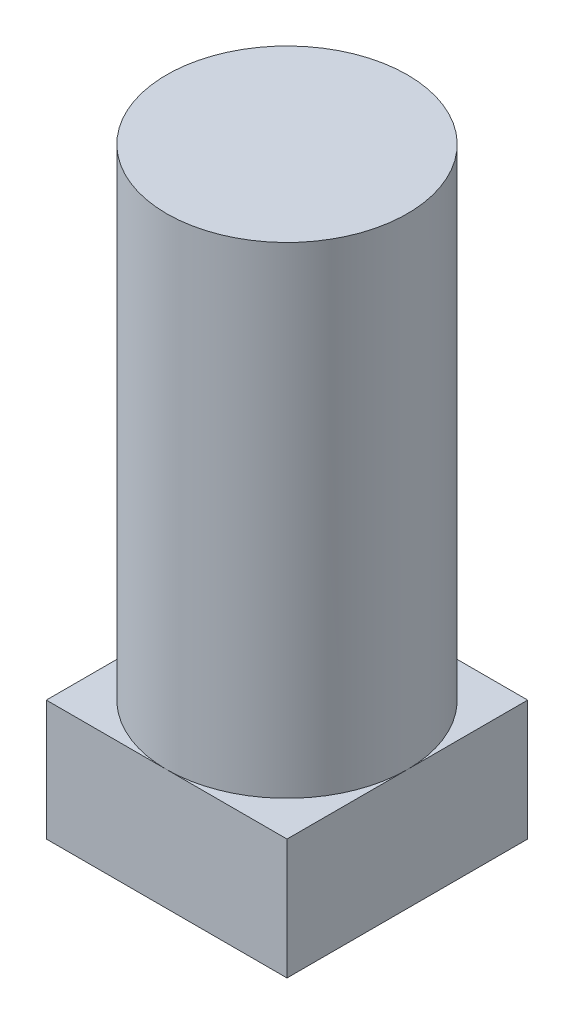
ISO-10303-21;
HEADER;
FILE_DESCRIPTION(('STEP AP214'),'2;1');
FILE_NAME('part.step','',(''),(''),'','','');
FILE_SCHEMA(('AUTOMOTIVE_DESIGN { 1 0 10303 214 1 1 1 1 }'));
ENDSEC;
DATA;
#1=APPLICATION_CONTEXT('core data for automotive mechanical design processes');
#2=APPLICATION_PROTOCOL_DEFINITION('international standard','automotive_design',2000,#1);
#3=PRODUCT_CONTEXT('',#1,'mechanical');
#4=PRODUCT('Part','Part','',(#3));
#5=PRODUCT_RELATED_PRODUCT_CATEGORY('part','',(#4));
#6=PRODUCT_DEFINITION_FORMATION('','',#4);
#7=PRODUCT_DEFINITION_CONTEXT('part definition',#1,'design');
#8=PRODUCT_DEFINITION('design','',#6,#7);
#9=PRODUCT_DEFINITION_SHAPE('','',#8);
#10=(LENGTH_UNIT() NAMED_UNIT(*) SI_UNIT(.MILLI.,.METRE.));
#11=(NAMED_UNIT(*) PLANE_ANGLE_UNIT() SI_UNIT($,.RADIAN.));
#12=(NAMED_UNIT(*) SI_UNIT($,.STERADIAN.) SOLID_ANGLE_UNIT());
#13=UNCERTAINTY_MEASURE_WITH_UNIT(LENGTH_MEASURE(1.E-05),#10,'distance_accuracy_value','');
#14=(GEOMETRIC_REPRESENTATION_CONTEXT(3) GLOBAL_UNCERTAINTY_ASSIGNED_CONTEXT((#13)) GLOBAL_UNIT_ASSIGNED_CONTEXT((#10,
#11,#12)) REPRESENTATION_CONTEXT('',''));
#15=CARTESIAN_POINT('',(0.,0.,0.));
#16=DIRECTION('',(0.,0.,1.));
#17=DIRECTION('',(1.,0.,0.));
#18=AXIS2_PLACEMENT_3D('',#15,#16,#17);
#19=CARTESIAN_POINT('',(0.,20.,0.));
#20=DIRECTION('',(0.,-1.,0.));
#21=DIRECTION('',(0.,0.,-1.));
#22=AXIS2_PLACEMENT_3D('',#19,#20,#21);
#23=CYLINDRICAL_SURFACE('',#22,5.);
#24=CARTESIAN_POINT('',(0.,20.,0.));
#25=DIRECTION('',(0.,1.,0.));
#26=DIRECTION('',(0.,0.,1.));
#27=AXIS2_PLACEMENT_3D('',#24,#25,#26);
#28=CIRCLE('',#27,5.);
#29=CARTESIAN_POINT('',(0.,20.,5.));
#30=VERTEX_POINT('',#29);
#31=EDGE_CURVE('E11',#30,#30,#28,.T.);
#32=ORIENTED_EDGE('',*,*,#31,.F.);
#33=EDGE_LOOP('',(#32));
#34=FACE_BOUND('',#33,.T.);
#35=CARTESIAN_POINT('',(0.,0.,0.));
#36=DIRECTION('',(0.,1.,0.));
#37=DIRECTION('',(0.,0.,1.));
#38=AXIS2_PLACEMENT_3D('',#35,#36,#37);
#39=CIRCLE('',#38,5.);
#40=CARTESIAN_POINT('',(0.,0.,5.));
#41=VERTEX_POINT('',#40);
#42=CARTESIAN_POINT('',(5.,0.,0.));
#43=VERTEX_POINT('',#42);
#44=EDGE_CURVE('E42',#41,#43,#39,.T.);
#45=ORIENTED_EDGE('',*,*,#44,.T.);
#46=CARTESIAN_POINT('',(0.,0.,-5.));
#47=VERTEX_POINT('',#46);
#48=EDGE_CURVE('E149',#43,#47,#39,.T.);
#49=ORIENTED_EDGE('',*,*,#48,.T.);
#50=CARTESIAN_POINT('',(-5.,0.,0.));
#51=VERTEX_POINT('',#50);
#52=EDGE_CURVE('E117',#47,#51,#39,.T.);
#53=ORIENTED_EDGE('',*,*,#52,.T.);
#54=EDGE_CURVE('E60',#51,#41,#39,.T.);
#55=ORIENTED_EDGE('',*,*,#54,.T.);
#56=EDGE_LOOP('',(#45,#49,#53,#55));
#57=FACE_BOUND('',#56,.T.);
#58=ADVANCED_FACE('F39',(#34,#57),#23,.T.);
#59=CARTESIAN_POINT('',(0.,20.,0.));
#60=DIRECTION('',(0.,1.,0.));
#61=DIRECTION('',(0.,0.,1.));
#62=AXIS2_PLACEMENT_3D('',#59,#60,#61);
#63=PLANE('',#62);
#64=ORIENTED_EDGE('',*,*,#31,.T.);
#65=EDGE_LOOP('',(#64));
#66=FACE_BOUND('',#65,.T.);
#67=ADVANCED_FACE('F168',(#66),#63,.T.);
#68=CARTESIAN_POINT('',(0.,0.,0.));
#69=DIRECTION('',(0.,1.,0.));
#70=DIRECTION('',(0.,0.,1.));
#71=AXIS2_PLACEMENT_3D('',#68,#69,#70);
#72=PLANE('',#71);
#73=ORIENTED_EDGE('',*,*,#44,.F.);
#74=DIRECTION('',(-1.,0.,0.));
#75=VECTOR('',#74,1.);
#76=CARTESIAN_POINT('',(-5.,0.,5.));
#77=LINE('',#76,#75);
#78=CARTESIAN_POINT('',(5.,0.,5.));
#79=VERTEX_POINT('',#78);
#80=EDGE_CURVE('E53',#79,#41,#77,.T.);
#81=ORIENTED_EDGE('',*,*,#80,.F.);
#82=DIRECTION('',(0.,0.,1.));
#83=VECTOR('',#82,1.);
#84=CARTESIAN_POINT('',(5.,0.,-5.));
#85=LINE('',#84,#83);
#86=EDGE_CURVE('E115',#43,#79,#85,.T.);
#87=ORIENTED_EDGE('',*,*,#86,.F.);
#88=EDGE_LOOP('',(#73,#81,#87));
#89=FACE_BOUND('',#88,.T.);
#90=ADVANCED_FACE('F154',(#89),#72,.T.);
#91=ORIENTED_EDGE('',*,*,#48,.F.);
#92=CARTESIAN_POINT('',(5.,0.,-5.));
#93=VERTEX_POINT('',#92);
#94=EDGE_CURVE('E134',#93,#43,#85,.T.);
#95=ORIENTED_EDGE('',*,*,#94,.F.);
#96=DIRECTION('',(1.,0.,0.));
#97=VECTOR('',#96,1.);
#98=CARTESIAN_POINT('',(-5.,0.,-5.));
#99=LINE('',#98,#97);
#100=EDGE_CURVE('E127',#47,#93,#99,.T.);
#101=ORIENTED_EDGE('',*,*,#100,.F.);
#102=EDGE_LOOP('',(#91,#95,#101));
#103=FACE_BOUND('',#102,.T.);
#104=ADVANCED_FACE('F147',(#103),#72,.T.);
#105=ORIENTED_EDGE('',*,*,#52,.F.);
#106=CARTESIAN_POINT('',(-5.,0.,-5.));
#107=VERTEX_POINT('',#106);
#108=EDGE_CURVE('E110',#107,#47,#99,.T.);
#109=ORIENTED_EDGE('',*,*,#108,.F.);
#110=DIRECTION('',(0.,0.,-1.));
#111=VECTOR('',#110,1.);
#112=CARTESIAN_POINT('',(-5.,0.,-5.));
#113=LINE('',#112,#111);
#114=EDGE_CURVE('E131',#51,#107,#113,.T.);
#115=ORIENTED_EDGE('',*,*,#114,.F.);
#116=EDGE_LOOP('',(#105,#109,#115));
#117=FACE_BOUND('',#116,.T.);
#118=ADVANCED_FACE('F156',(#117),#72,.T.);
#119=ORIENTED_EDGE('',*,*,#54,.F.);
#120=CARTESIAN_POINT('',(-5.,0.,5.));
#121=VERTEX_POINT('',#120);
#122=EDGE_CURVE('E128',#121,#51,#113,.T.);
#123=ORIENTED_EDGE('',*,*,#122,.F.);
#124=EDGE_CURVE('E133',#41,#121,#77,.T.);
#125=ORIENTED_EDGE('',*,*,#124,.F.);
#126=EDGE_LOOP('',(#119,#123,#125));
#127=FACE_BOUND('',#126,.T.);
#128=ADVANCED_FACE('F157',(#127),#72,.T.);
#129=CARTESIAN_POINT('',(5.,-5.,-5.));
#130=DIRECTION('',(-1.,0.,0.));
#131=DIRECTION('',(0.,0.,1.));
#132=AXIS2_PLACEMENT_3D('',#129,#130,#131);
#133=PLANE('',#132);
#134=ORIENTED_EDGE('',*,*,#94,.T.);
#135=ORIENTED_EDGE('',*,*,#86,.T.);
#136=DIRECTION('',(0.,1.,0.));
#137=VECTOR('',#136,1.);
#138=CARTESIAN_POINT('',(5.,-5.,5.));
#139=LINE('',#138,#137);
#140=CARTESIAN_POINT('',(5.,-5.,5.));
#141=VERTEX_POINT('',#140);
#142=EDGE_CURVE('E95',#141,#79,#139,.T.);
#143=ORIENTED_EDGE('',*,*,#142,.F.);
#144=DIRECTION('',(0.,0.,1.));
#145=VECTOR('',#144,1.);
#146=CARTESIAN_POINT('',(5.,-5.,-5.));
#147=LINE('',#146,#145);
#148=CARTESIAN_POINT('',(5.,-5.,-5.));
#149=VERTEX_POINT('',#148);
#150=EDGE_CURVE('E101',#149,#141,#147,.T.);
#151=ORIENTED_EDGE('',*,*,#150,.F.);
#152=DIRECTION('',(0.,1.,0.));
#153=VECTOR('',#152,1.);
#154=CARTESIAN_POINT('',(5.,-5.,-5.));
#155=LINE('',#154,#153);
#156=EDGE_CURVE('E123',#149,#93,#155,.T.);
#157=ORIENTED_EDGE('',*,*,#156,.T.);
#158=EDGE_LOOP('',(#134,#135,#143,#151,#157));
#159=FACE_BOUND('',#158,.T.);
#160=ADVANCED_FACE('F113',(#159),#133,.F.);
#161=CARTESIAN_POINT('',(-5.,-5.,5.));
#162=DIRECTION('',(0.,0.,-1.));
#163=DIRECTION('',(-1.,0.,0.));
#164=AXIS2_PLACEMENT_3D('',#161,#162,#163);
#165=PLANE('',#164);
#166=ORIENTED_EDGE('',*,*,#80,.T.);
#167=ORIENTED_EDGE('',*,*,#124,.T.);
#168=DIRECTION('',(0.,1.,0.));
#169=VECTOR('',#168,1.);
#170=CARTESIAN_POINT('',(-5.,-5.,5.));
#171=LINE('',#170,#169);
#172=CARTESIAN_POINT('',(-5.,-5.,5.));
#173=VERTEX_POINT('',#172);
#174=EDGE_CURVE('E97',#173,#121,#171,.T.);
#175=ORIENTED_EDGE('',*,*,#174,.F.);
#176=DIRECTION('',(-1.,0.,0.));
#177=VECTOR('',#176,1.);
#178=CARTESIAN_POINT('',(-5.,-5.,5.));
#179=LINE('',#178,#177);
#180=EDGE_CURVE('E91',#141,#173,#179,.T.);
#181=ORIENTED_EDGE('',*,*,#180,.F.);
#182=ORIENTED_EDGE('',*,*,#142,.T.);
#183=EDGE_LOOP('',(#166,#167,#175,#181,#182));
#184=FACE_BOUND('',#183,.T.);
#185=ADVANCED_FACE('F93',(#184),#165,.F.);
#186=CARTESIAN_POINT('',(-5.,-5.,-5.));
#187=DIRECTION('',(1.,0.,0.));
#188=DIRECTION('',(0.,0.,-1.));
#189=AXIS2_PLACEMENT_3D('',#186,#187,#188);
#190=PLANE('',#189);
#191=ORIENTED_EDGE('',*,*,#122,.T.);
#192=ORIENTED_EDGE('',*,*,#114,.T.);
#193=DIRECTION('',(0.,1.,0.));
#194=VECTOR('',#193,1.);
#195=CARTESIAN_POINT('',(-5.,-5.,-5.));
#196=LINE('',#195,#194);
#197=CARTESIAN_POINT('',(-5.,-5.,-5.));
#198=VERTEX_POINT('',#197);
#199=EDGE_CURVE('E118',#198,#107,#196,.T.);
#200=ORIENTED_EDGE('',*,*,#199,.F.);
#201=DIRECTION('',(0.,0.,-1.));
#202=VECTOR('',#201,1.);
#203=CARTESIAN_POINT('',(-5.,-5.,-5.));
#204=LINE('',#203,#202);
#205=EDGE_CURVE('E100',#173,#198,#204,.T.);
#206=ORIENTED_EDGE('',*,*,#205,.F.);
#207=ORIENTED_EDGE('',*,*,#174,.T.);
#208=EDGE_LOOP('',(#191,#192,#200,#206,#207));
#209=FACE_BOUND('',#208,.T.);
#210=ADVANCED_FACE('F139',(#209),#190,.F.);
#211=CARTESIAN_POINT('',(-5.,-5.,-5.));
#212=DIRECTION('',(0.,0.,1.));
#213=DIRECTION('',(1.,0.,0.));
#214=AXIS2_PLACEMENT_3D('',#211,#212,#213);
#215=PLANE('',#214);
#216=ORIENTED_EDGE('',*,*,#108,.T.);
#217=ORIENTED_EDGE('',*,*,#100,.T.);
#218=ORIENTED_EDGE('',*,*,#156,.F.);
#219=DIRECTION('',(1.,0.,0.));
#220=VECTOR('',#219,1.);
#221=CARTESIAN_POINT('',(-5.,-5.,-5.));
#222=LINE('',#221,#220);
#223=EDGE_CURVE('E106',#198,#149,#222,.T.);
#224=ORIENTED_EDGE('',*,*,#223,.F.);
#225=ORIENTED_EDGE('',*,*,#199,.T.);
#226=EDGE_LOOP('',(#216,#217,#218,#224,#225));
#227=FACE_BOUND('',#226,.T.);
#228=ADVANCED_FACE('F142',(#227),#215,.F.);
#229=CARTESIAN_POINT('',(0.,-5.,0.));
#230=DIRECTION('',(0.,1.,0.));
#231=DIRECTION('',(0.,0.,1.));
#232=AXIS2_PLACEMENT_3D('',#229,#230,#231);
#233=PLANE('',#232);
#234=ORIENTED_EDGE('',*,*,#150,.T.);
#235=ORIENTED_EDGE('',*,*,#180,.T.);
#236=ORIENTED_EDGE('',*,*,#205,.T.);
#237=ORIENTED_EDGE('',*,*,#223,.T.);
#238=EDGE_LOOP('',(#234,#235,#236,#237));
#239=FACE_BOUND('',#238,.T.);
#240=ADVANCED_FACE('F104',(#239),#233,.F.);
#241=CLOSED_SHELL('',(#58,#67,#90,#104,#118,#128,#160,#185,#210,#228,#240));
#242=MANIFOLD_SOLID_BREP('B2',#241);
#243=ADVANCED_BREP_SHAPE_REPRESENTATION('',(#18,#242),#14);
#244=SHAPE_DEFINITION_REPRESENTATION(#9,#243);
ENDSEC;
END-ISO-10303-21;
